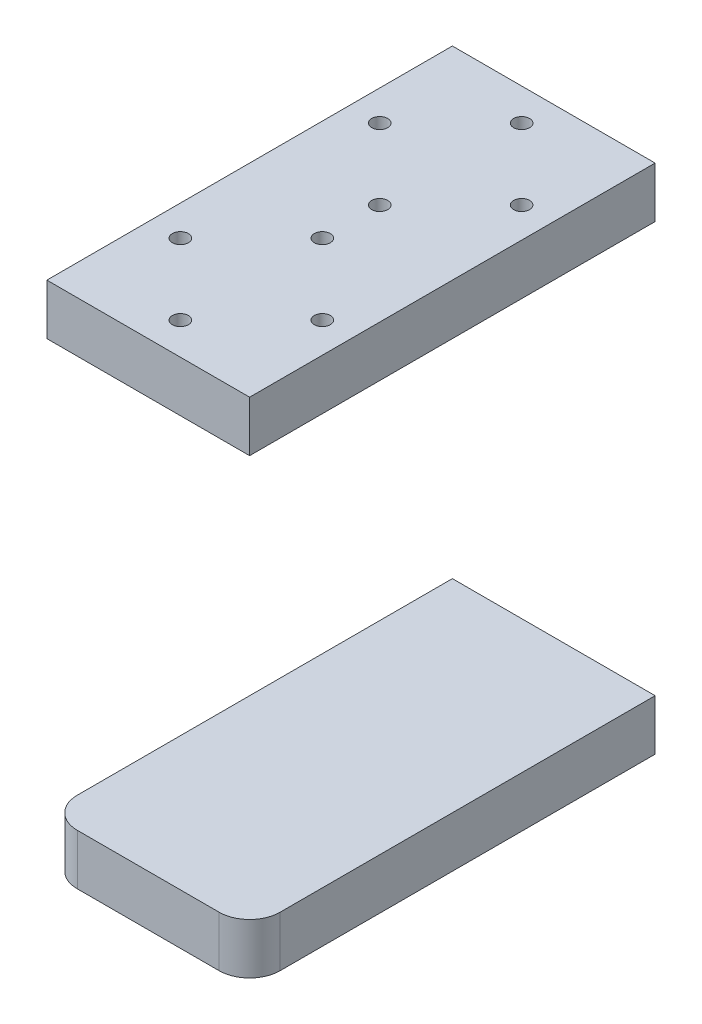
ISO-10303-21;
HEADER;
FILE_DESCRIPTION(('STEP AP214'),'2;1');
FILE_NAME('part.step','',(''),(''),'','','');
FILE_SCHEMA(('AUTOMOTIVE_DESIGN { 1 0 10303 214 1 1 1 1 }'));
ENDSEC;
DATA;
#1=APPLICATION_CONTEXT('core data for automotive mechanical design processes');
#2=APPLICATION_PROTOCOL_DEFINITION('international standard','automotive_design',2000,#1);
#3=PRODUCT_CONTEXT('',#1,'mechanical');
#4=PRODUCT('Part','Part','',(#3));
#5=PRODUCT_RELATED_PRODUCT_CATEGORY('part','',(#4));
#6=PRODUCT_DEFINITION_FORMATION('','',#4);
#7=PRODUCT_DEFINITION_CONTEXT('part definition',#1,'design');
#8=PRODUCT_DEFINITION('design','',#6,#7);
#9=PRODUCT_DEFINITION_SHAPE('','',#8);
#10=(LENGTH_UNIT() NAMED_UNIT(*) SI_UNIT(.MILLI.,.METRE.));
#11=(NAMED_UNIT(*) PLANE_ANGLE_UNIT() SI_UNIT($,.RADIAN.));
#12=(NAMED_UNIT(*) SI_UNIT($,.STERADIAN.) SOLID_ANGLE_UNIT());
#13=UNCERTAINTY_MEASURE_WITH_UNIT(LENGTH_MEASURE(1.E-05),#10,'distance_accuracy_value','');
#14=(GEOMETRIC_REPRESENTATION_CONTEXT(3) GLOBAL_UNCERTAINTY_ASSIGNED_CONTEXT((#13)) GLOBAL_UNIT_ASSIGNED_CONTEXT((#10,
#11,#12)) REPRESENTATION_CONTEXT('',''));
#15=CARTESIAN_POINT('',(0.,0.,0.));
#16=DIRECTION('',(0.,0.,1.));
#17=DIRECTION('',(1.,0.,0.));
#18=AXIS2_PLACEMENT_3D('',#15,#16,#17);
#19=CARTESIAN_POINT('',(0.,0.,40.));
#20=DIRECTION('',(1.,0.,0.));
#21=DIRECTION('',(0.,0.,-1.));
#22=AXIS2_PLACEMENT_3D('',#19,#20,#21);
#23=PLANE('',#22);
#24=DIRECTION('',(0.,-1.,0.));
#25=VECTOR('',#24,1.);
#26=CARTESIAN_POINT('',(0.,0.,0.));
#27=LINE('',#26,#25);
#28=CARTESIAN_POINT('',(0.,50.5,0.));
#29=VERTEX_POINT('',#28);
#30=CARTESIAN_POINT('',(0.,45.5,0.));
#31=VERTEX_POINT('',#30);
#32=EDGE_CURVE('E86',#29,#31,#27,.T.);
#33=ORIENTED_EDGE('',*,*,#32,.T.);
#34=DIRECTION('',(0.,0.,1.));
#35=VECTOR('',#34,1.);
#36=CARTESIAN_POINT('',(0.,45.5,0.));
#37=LINE('',#36,#35);
#38=CARTESIAN_POINT('',(0.,45.5,40.));
#39=VERTEX_POINT('',#38);
#40=EDGE_CURVE('E77',#31,#39,#37,.T.);
#41=ORIENTED_EDGE('',*,*,#40,.T.);
#42=DIRECTION('',(0.,-1.,0.));
#43=VECTOR('',#42,1.);
#44=CARTESIAN_POINT('',(0.,0.,40.));
#45=LINE('',#44,#43);
#46=CARTESIAN_POINT('',(0.,50.5,40.));
#47=VERTEX_POINT('',#46);
#48=EDGE_CURVE('E145',#47,#39,#45,.T.);
#49=ORIENTED_EDGE('',*,*,#48,.F.);
#50=DIRECTION('',(0.,0.,-1.));
#51=VECTOR('',#50,1.);
#52=CARTESIAN_POINT('',(0.,50.5,40.));
#53=LINE('',#52,#51);
#54=EDGE_CURVE('E85',#47,#29,#53,.T.);
#55=ORIENTED_EDGE('',*,*,#54,.T.);
#56=EDGE_LOOP('',(#33,#41,#49,#55));
#57=FACE_BOUND('',#56,.T.);
#58=ADVANCED_FACE('F43',(#57),#23,.F.);
#59=CARTESIAN_POINT('',(20.,0.,40.));
#60=DIRECTION('',(-1.,0.,0.));
#61=DIRECTION('',(0.,0.,1.));
#62=AXIS2_PLACEMENT_3D('',#59,#60,#61);
#63=PLANE('',#62);
#64=DIRECTION('',(0.,1.,0.));
#65=VECTOR('',#64,1.);
#66=CARTESIAN_POINT('',(20.,0.,40.));
#67=LINE('',#66,#65);
#68=CARTESIAN_POINT('',(20.,45.5,40.));
#69=VERTEX_POINT('',#68);
#70=CARTESIAN_POINT('',(20.,50.5,40.));
#71=VERTEX_POINT('',#70);
#72=EDGE_CURVE('E142',#69,#71,#67,.T.);
#73=ORIENTED_EDGE('',*,*,#72,.F.);
#74=DIRECTION('',(0.,0.,1.));
#75=VECTOR('',#74,1.);
#76=CARTESIAN_POINT('',(20.,45.5,0.));
#77=LINE('',#76,#75);
#78=CARTESIAN_POINT('',(20.,45.5,0.));
#79=VERTEX_POINT('',#78);
#80=EDGE_CURVE('E12',#79,#69,#77,.T.);
#81=ORIENTED_EDGE('',*,*,#80,.F.);
#82=DIRECTION('',(0.,1.,0.));
#83=VECTOR('',#82,1.);
#84=CARTESIAN_POINT('',(20.,0.,0.));
#85=LINE('',#84,#83);
#86=CARTESIAN_POINT('',(20.,50.5,0.));
#87=VERTEX_POINT('',#86);
#88=EDGE_CURVE('E93',#79,#87,#85,.T.);
#89=ORIENTED_EDGE('',*,*,#88,.T.);
#90=DIRECTION('',(0.,0.,-1.));
#91=VECTOR('',#90,1.);
#92=CARTESIAN_POINT('',(20.,50.5,40.));
#93=LINE('',#92,#91);
#94=EDGE_CURVE('E137',#71,#87,#93,.T.);
#95=ORIENTED_EDGE('',*,*,#94,.F.);
#96=EDGE_LOOP('',(#73,#81,#89,#95));
#97=FACE_BOUND('',#96,.T.);
#98=ADVANCED_FACE('F150',(#97),#63,.F.);
#99=CARTESIAN_POINT('',(0.,0.,40.));
#100=DIRECTION('',(0.,0.,-1.));
#101=DIRECTION('',(-1.,0.,0.));
#102=AXIS2_PLACEMENT_3D('',#99,#100,#101);
#103=PLANE('',#102);
#104=ORIENTED_EDGE('',*,*,#48,.T.);
#105=DIRECTION('',(-1.,0.,0.));
#106=VECTOR('',#105,1.);
#107=CARTESIAN_POINT('',(0.,45.5,40.));
#108=LINE('',#107,#106);
#109=EDGE_CURVE('E52',#69,#39,#108,.T.);
#110=ORIENTED_EDGE('',*,*,#109,.F.);
#111=ORIENTED_EDGE('',*,*,#72,.T.);
#112=DIRECTION('',(-1.,0.,0.));
#113=VECTOR('',#112,1.);
#114=CARTESIAN_POINT('',(0.,50.5,40.));
#115=LINE('',#114,#113);
#116=EDGE_CURVE('E95',#71,#47,#115,.T.);
#117=ORIENTED_EDGE('',*,*,#116,.T.);
#118=EDGE_LOOP('',(#104,#110,#111,#117));
#119=FACE_BOUND('',#118,.T.);
#120=ADVANCED_FACE('F154',(#119),#103,.F.);
#121=CARTESIAN_POINT('',(0.,0.,0.));
#122=DIRECTION('',(0.,0.,-1.));
#123=DIRECTION('',(-1.,0.,0.));
#124=AXIS2_PLACEMENT_3D('',#121,#122,#123);
#125=PLANE('',#124);
#126=DIRECTION('',(-1.,0.,0.));
#127=VECTOR('',#126,1.);
#128=CARTESIAN_POINT('',(0.,45.5,0.));
#129=LINE('',#128,#127);
#130=EDGE_CURVE('E80',#79,#31,#129,.T.);
#131=ORIENTED_EDGE('',*,*,#130,.T.);
#132=ORIENTED_EDGE('',*,*,#32,.F.);
#133=DIRECTION('',(-1.,0.,0.));
#134=VECTOR('',#133,1.);
#135=CARTESIAN_POINT('',(0.,50.5,0.));
#136=LINE('',#135,#134);
#137=EDGE_CURVE('E94',#87,#29,#136,.T.);
#138=ORIENTED_EDGE('',*,*,#137,.F.);
#139=ORIENTED_EDGE('',*,*,#88,.F.);
#140=EDGE_LOOP('',(#131,#132,#138,#139));
#141=FACE_BOUND('',#140,.T.);
#142=ADVANCED_FACE('F91',(#141),#125,.T.);
#143=CARTESIAN_POINT('',(0.,50.5,40.));
#144=DIRECTION('',(0.,-1.,0.));
#145=DIRECTION('',(0.,0.,-1.));
#146=AXIS2_PLACEMENT_3D('',#143,#144,#145);
#147=PLANE('',#146);
#148=CARTESIAN_POINT('',(9.99999999999996,50.5,22.8301418666942));
#149=DIRECTION('',(0.,1.,0.));
#150=DIRECTION('',(0.,0.,1.));
#151=AXIS2_PLACEMENT_3D('',#148,#149,#150);
#152=CIRCLE('',#151,0.790000000000002);
#153=CARTESIAN_POINT('',(9.99999999999996,50.5,23.6201418666942));
#154=VERTEX_POINT('',#153);
#155=EDGE_CURVE('E111',#154,#154,#152,.T.);
#156=ORIENTED_EDGE('',*,*,#155,.F.);
#157=EDGE_LOOP('',(#156));
#158=FACE_BOUND('',#157,.T.);
#159=CARTESIAN_POINT('',(2.99999999999997,50.5,29.8301418666942));
#160=DIRECTION('',(0.,1.,0.));
#161=DIRECTION('',(0.,0.,1.));
#162=AXIS2_PLACEMENT_3D('',#159,#160,#161);
#163=CIRCLE('',#162,0.789999999999999);
#164=CARTESIAN_POINT('',(2.99999999999997,50.5,30.6201418666942));
#165=VERTEX_POINT('',#164);
#166=EDGE_CURVE('E282',#165,#165,#163,.T.);
#167=ORIENTED_EDGE('',*,*,#166,.F.);
#168=EDGE_LOOP('',(#167));
#169=FACE_BOUND('',#168,.T.);
#170=CARTESIAN_POINT('',(9.99999999999997,50.5,36.8301418666942));
#171=DIRECTION('',(0.,1.,0.));
#172=DIRECTION('',(0.,0.,1.));
#173=AXIS2_PLACEMENT_3D('',#170,#171,#172);
#174=CIRCLE('',#173,0.789999999999997);
#175=CARTESIAN_POINT('',(9.99999999999997,50.5,37.6201418666942));
#176=VERTEX_POINT('',#175);
#177=EDGE_CURVE('E285',#176,#176,#174,.T.);
#178=ORIENTED_EDGE('',*,*,#177,.F.);
#179=EDGE_LOOP('',(#178));
#180=FACE_BOUND('',#179,.T.);
#181=CARTESIAN_POINT('',(17.,50.5,10.1698581333058));
#182=DIRECTION('',(0.,1.,0.));
#183=DIRECTION('',(0.,0.,-1.));
#184=AXIS2_PLACEMENT_3D('',#181,#182,#183);
#185=CIRCLE('',#184,0.789999999999999);
#186=CARTESIAN_POINT('',(17.,50.5,9.37985813330584));
#187=VERTEX_POINT('',#186);
#188=EDGE_CURVE('E294',#187,#187,#185,.T.);
#189=ORIENTED_EDGE('',*,*,#188,.F.);
#190=EDGE_LOOP('',(#189));
#191=FACE_BOUND('',#190,.T.);
#192=CARTESIAN_POINT('',(9.99999999999996,50.5,17.1698581333058));
#193=DIRECTION('',(0.,1.,0.));
#194=DIRECTION('',(0.,0.,-1.));
#195=AXIS2_PLACEMENT_3D('',#192,#193,#194);
#196=CIRCLE('',#195,0.790000000000002);
#197=CARTESIAN_POINT('',(9.99999999999996,50.5,16.3798581333058));
#198=VERTEX_POINT('',#197);
#199=EDGE_CURVE('E291',#198,#198,#196,.T.);
#200=ORIENTED_EDGE('',*,*,#199,.F.);
#201=EDGE_LOOP('',(#200));
#202=FACE_BOUND('',#201,.T.);
#203=CARTESIAN_POINT('',(2.99999999999997,50.5,10.1698581333058));
#204=DIRECTION('',(0.,1.,0.));
#205=DIRECTION('',(0.,0.,-1.));
#206=AXIS2_PLACEMENT_3D('',#203,#204,#205);
#207=CIRCLE('',#206,0.789999999999999);
#208=CARTESIAN_POINT('',(2.99999999999997,50.5,9.37985813330584));
#209=VERTEX_POINT('',#208);
#210=EDGE_CURVE('E135',#209,#209,#207,.T.);
#211=ORIENTED_EDGE('',*,*,#210,.F.);
#212=EDGE_LOOP('',(#211));
#213=FACE_BOUND('',#212,.T.);
#214=CARTESIAN_POINT('',(9.99999999999997,50.5,3.16985813330584));
#215=DIRECTION('',(0.,1.,0.));
#216=DIRECTION('',(0.,0.,-1.));
#217=AXIS2_PLACEMENT_3D('',#214,#215,#216);
#218=CIRCLE('',#217,0.789999999999997);
#219=CARTESIAN_POINT('',(9.99999999999997,50.5,2.37985813330585));
#220=VERTEX_POINT('',#219);
#221=EDGE_CURVE('E290',#220,#220,#218,.T.);
#222=ORIENTED_EDGE('',*,*,#221,.F.);
#223=EDGE_LOOP('',(#222));
#224=FACE_BOUND('',#223,.T.);
#225=CARTESIAN_POINT('',(17.,50.5,29.8301418666942));
#226=DIRECTION('',(0.,1.,0.));
#227=DIRECTION('',(0.,0.,1.));
#228=AXIS2_PLACEMENT_3D('',#225,#226,#227);
#229=CIRCLE('',#228,0.789999999999999);
#230=CARTESIAN_POINT('',(17.,50.5,30.6201418666942));
#231=VERTEX_POINT('',#230);
#232=EDGE_CURVE('E102',#231,#231,#229,.T.);
#233=ORIENTED_EDGE('',*,*,#232,.F.);
#234=EDGE_LOOP('',(#233));
#235=FACE_BOUND('',#234,.T.);
#236=ORIENTED_EDGE('',*,*,#137,.T.);
#237=ORIENTED_EDGE('',*,*,#54,.F.);
#238=ORIENTED_EDGE('',*,*,#116,.F.);
#239=ORIENTED_EDGE('',*,*,#94,.T.);
#240=EDGE_LOOP('',(#236,#237,#238,#239));
#241=FACE_BOUND('',#240,.T.);
#242=ADVANCED_FACE('F153',(#158,#169,#180,#191,#202,#213,#224,#235,#241),#147,.F.);
#243=CARTESIAN_POINT('',(0.,45.5,0.));
#244=DIRECTION('',(0.,1.,0.));
#245=DIRECTION('',(0.,0.,1.));
#246=AXIS2_PLACEMENT_3D('',#243,#244,#245);
#247=PLANE('',#246);
#248=CARTESIAN_POINT('',(9.99999999999996,45.5,22.8301418666942));
#249=DIRECTION('',(0.,1.,0.));
#250=DIRECTION('',(0.,0.,1.));
#251=AXIS2_PLACEMENT_3D('',#248,#249,#250);
#252=CIRCLE('',#251,0.790000000000002);
#253=CARTESIAN_POINT('',(9.99999999999996,45.5,23.6201418666942));
#254=VERTEX_POINT('',#253);
#255=EDGE_CURVE('E46',#254,#254,#252,.T.);
#256=ORIENTED_EDGE('',*,*,#255,.T.);
#257=EDGE_LOOP('',(#256));
#258=FACE_BOUND('',#257,.T.);
#259=CARTESIAN_POINT('',(2.99999999999997,45.5,29.8301418666942));
#260=DIRECTION('',(0.,1.,0.));
#261=DIRECTION('',(0.,0.,1.));
#262=AXIS2_PLACEMENT_3D('',#259,#260,#261);
#263=CIRCLE('',#262,0.789999999999999);
#264=CARTESIAN_POINT('',(2.99999999999997,45.5,30.6201418666942));
#265=VERTEX_POINT('',#264);
#266=EDGE_CURVE('E122',#265,#265,#263,.T.);
#267=ORIENTED_EDGE('',*,*,#266,.T.);
#268=EDGE_LOOP('',(#267));
#269=FACE_BOUND('',#268,.T.);
#270=CARTESIAN_POINT('',(9.99999999999997,45.5,36.8301418666942));
#271=DIRECTION('',(0.,1.,0.));
#272=DIRECTION('',(0.,0.,1.));
#273=AXIS2_PLACEMENT_3D('',#270,#271,#272);
#274=CIRCLE('',#273,0.789999999999997);
#275=CARTESIAN_POINT('',(9.99999999999997,45.5,37.6201418666942));
#276=VERTEX_POINT('',#275);
#277=EDGE_CURVE('E120',#276,#276,#274,.T.);
#278=ORIENTED_EDGE('',*,*,#277,.T.);
#279=EDGE_LOOP('',(#278));
#280=FACE_BOUND('',#279,.T.);
#281=CARTESIAN_POINT('',(17.,45.5,10.1698581333058));
#282=DIRECTION('',(0.,1.,0.));
#283=DIRECTION('',(0.,0.,1.));
#284=AXIS2_PLACEMENT_3D('',#281,#282,#283);
#285=CIRCLE('',#284,0.789999999999999);
#286=CARTESIAN_POINT('',(17.,45.5,10.9598581333058));
#287=VERTEX_POINT('',#286);
#288=EDGE_CURVE('E117',#287,#287,#285,.T.);
#289=ORIENTED_EDGE('',*,*,#288,.T.);
#290=EDGE_LOOP('',(#289));
#291=FACE_BOUND('',#290,.T.);
#292=CARTESIAN_POINT('',(9.99999999999996,45.5,17.1698581333058));
#293=DIRECTION('',(0.,1.,0.));
#294=DIRECTION('',(0.,0.,1.));
#295=AXIS2_PLACEMENT_3D('',#292,#293,#294);
#296=CIRCLE('',#295,0.790000000000002);
#297=CARTESIAN_POINT('',(9.99999999999996,45.5,17.9598581333058));
#298=VERTEX_POINT('',#297);
#299=EDGE_CURVE('E114',#298,#298,#296,.T.);
#300=ORIENTED_EDGE('',*,*,#299,.T.);
#301=EDGE_LOOP('',(#300));
#302=FACE_BOUND('',#301,.T.);
#303=CARTESIAN_POINT('',(2.99999999999997,45.5,10.1698581333058));
#304=DIRECTION('',(0.,1.,0.));
#305=DIRECTION('',(0.,0.,1.));
#306=AXIS2_PLACEMENT_3D('',#303,#304,#305);
#307=CIRCLE('',#306,0.789999999999999);
#308=CARTESIAN_POINT('',(2.99999999999997,45.5,10.9598581333058));
#309=VERTEX_POINT('',#308);
#310=EDGE_CURVE('E110',#309,#309,#307,.T.);
#311=ORIENTED_EDGE('',*,*,#310,.T.);
#312=EDGE_LOOP('',(#311));
#313=FACE_BOUND('',#312,.T.);
#314=CARTESIAN_POINT('',(9.99999999999997,45.5,3.16985813330584));
#315=DIRECTION('',(0.,1.,0.));
#316=DIRECTION('',(0.,0.,1.));
#317=AXIS2_PLACEMENT_3D('',#314,#315,#316);
#318=CIRCLE('',#317,0.789999999999997);
#319=CARTESIAN_POINT('',(9.99999999999997,45.5,3.95985813330584));
#320=VERTEX_POINT('',#319);
#321=EDGE_CURVE('E107',#320,#320,#318,.T.);
#322=ORIENTED_EDGE('',*,*,#321,.T.);
#323=EDGE_LOOP('',(#322));
#324=FACE_BOUND('',#323,.T.);
#325=CARTESIAN_POINT('',(17.,45.5,29.8301418666942));
#326=DIRECTION('',(0.,1.,0.));
#327=DIRECTION('',(0.,0.,1.));
#328=AXIS2_PLACEMENT_3D('',#325,#326,#327);
#329=CIRCLE('',#328,0.789999999999999);
#330=CARTESIAN_POINT('',(17.,45.5,30.6201418666942));
#331=VERTEX_POINT('',#330);
#332=EDGE_CURVE('E99',#331,#331,#329,.T.);
#333=ORIENTED_EDGE('',*,*,#332,.T.);
#334=EDGE_LOOP('',(#333));
#335=FACE_BOUND('',#334,.T.);
#336=ORIENTED_EDGE('',*,*,#109,.T.);
#337=ORIENTED_EDGE('',*,*,#40,.F.);
#338=ORIENTED_EDGE('',*,*,#130,.F.);
#339=ORIENTED_EDGE('',*,*,#80,.T.);
#340=EDGE_LOOP('',(#336,#337,#338,#339));
#341=FACE_BOUND('',#340,.T.);
#342=ADVANCED_FACE('F79',(#258,#269,#280,#291,#302,#313,#324,#335,#341),#247,.F.);
#343=CARTESIAN_POINT('',(17.,30.5,29.8301418666942));
#344=DIRECTION('',(0.,1.,0.));
#345=DIRECTION('',(0.,0.,1.));
#346=AXIS2_PLACEMENT_3D('',#343,#344,#345);
#347=CYLINDRICAL_SURFACE('',#346,0.789999999999999);
#348=ORIENTED_EDGE('',*,*,#232,.T.);
#349=EDGE_LOOP('',(#348));
#350=FACE_BOUND('',#349,.T.);
#351=ORIENTED_EDGE('',*,*,#332,.F.);
#352=EDGE_LOOP('',(#351));
#353=FACE_BOUND('',#352,.T.);
#354=ADVANCED_FACE('F198',(#350,#353),#347,.F.);
#355=CARTESIAN_POINT('',(9.99999999999997,30.5,3.16985813330584));
#356=DIRECTION('',(0.,1.,0.));
#357=DIRECTION('',(0.,0.,1.));
#358=AXIS2_PLACEMENT_3D('',#355,#356,#357);
#359=CYLINDRICAL_SURFACE('',#358,0.789999999999997);
#360=ORIENTED_EDGE('',*,*,#221,.T.);
#361=EDGE_LOOP('',(#360));
#362=FACE_BOUND('',#361,.T.);
#363=ORIENTED_EDGE('',*,*,#321,.F.);
#364=EDGE_LOOP('',(#363));
#365=FACE_BOUND('',#364,.T.);
#366=ADVANCED_FACE('F206',(#362,#365),#359,.F.);
#367=CARTESIAN_POINT('',(2.99999999999997,30.5,10.1698581333058));
#368=DIRECTION('',(0.,1.,0.));
#369=DIRECTION('',(0.,0.,1.));
#370=AXIS2_PLACEMENT_3D('',#367,#368,#369);
#371=CYLINDRICAL_SURFACE('',#370,0.789999999999999);
#372=ORIENTED_EDGE('',*,*,#210,.T.);
#373=EDGE_LOOP('',(#372));
#374=FACE_BOUND('',#373,.T.);
#375=ORIENTED_EDGE('',*,*,#310,.F.);
#376=EDGE_LOOP('',(#375));
#377=FACE_BOUND('',#376,.T.);
#378=ADVANCED_FACE('F215',(#374,#377),#371,.F.);
#379=CARTESIAN_POINT('',(9.99999999999996,30.5,17.1698581333058));
#380=DIRECTION('',(0.,1.,0.));
#381=DIRECTION('',(0.,0.,1.));
#382=AXIS2_PLACEMENT_3D('',#379,#380,#381);
#383=CYLINDRICAL_SURFACE('',#382,0.790000000000002);
#384=ORIENTED_EDGE('',*,*,#199,.T.);
#385=EDGE_LOOP('',(#384));
#386=FACE_BOUND('',#385,.T.);
#387=ORIENTED_EDGE('',*,*,#299,.F.);
#388=EDGE_LOOP('',(#387));
#389=FACE_BOUND('',#388,.T.);
#390=ADVANCED_FACE('F225',(#386,#389),#383,.F.);
#391=CARTESIAN_POINT('',(17.,30.5,10.1698581333058));
#392=DIRECTION('',(0.,1.,0.));
#393=DIRECTION('',(0.,0.,1.));
#394=AXIS2_PLACEMENT_3D('',#391,#392,#393);
#395=CYLINDRICAL_SURFACE('',#394,0.789999999999999);
#396=ORIENTED_EDGE('',*,*,#188,.T.);
#397=EDGE_LOOP('',(#396));
#398=FACE_BOUND('',#397,.T.);
#399=ORIENTED_EDGE('',*,*,#288,.F.);
#400=EDGE_LOOP('',(#399));
#401=FACE_BOUND('',#400,.T.);
#402=ADVANCED_FACE('F235',(#398,#401),#395,.F.);
#403=CARTESIAN_POINT('',(9.99999999999997,30.5,36.8301418666942));
#404=DIRECTION('',(0.,1.,0.));
#405=DIRECTION('',(0.,0.,1.));
#406=AXIS2_PLACEMENT_3D('',#403,#404,#405);
#407=CYLINDRICAL_SURFACE('',#406,0.789999999999997);
#408=ORIENTED_EDGE('',*,*,#177,.T.);
#409=EDGE_LOOP('',(#408));
#410=FACE_BOUND('',#409,.T.);
#411=ORIENTED_EDGE('',*,*,#277,.F.);
#412=EDGE_LOOP('',(#411));
#413=FACE_BOUND('',#412,.T.);
#414=ADVANCED_FACE('F245',(#410,#413),#407,.F.);
#415=CARTESIAN_POINT('',(2.99999999999997,30.5,29.8301418666942));
#416=DIRECTION('',(0.,1.,0.));
#417=DIRECTION('',(0.,0.,1.));
#418=AXIS2_PLACEMENT_3D('',#415,#416,#417);
#419=CYLINDRICAL_SURFACE('',#418,0.789999999999999);
#420=ORIENTED_EDGE('',*,*,#166,.T.);
#421=EDGE_LOOP('',(#420));
#422=FACE_BOUND('',#421,.T.);
#423=ORIENTED_EDGE('',*,*,#266,.F.);
#424=EDGE_LOOP('',(#423));
#425=FACE_BOUND('',#424,.T.);
#426=ADVANCED_FACE('F255',(#422,#425),#419,.F.);
#427=CARTESIAN_POINT('',(9.99999999999996,30.5,22.8301418666942));
#428=DIRECTION('',(0.,1.,0.));
#429=DIRECTION('',(0.,0.,1.));
#430=AXIS2_PLACEMENT_3D('',#427,#428,#429);
#431=CYLINDRICAL_SURFACE('',#430,0.790000000000002);
#432=ORIENTED_EDGE('',*,*,#155,.T.);
#433=EDGE_LOOP('',(#432));
#434=FACE_BOUND('',#433,.T.);
#435=ORIENTED_EDGE('',*,*,#255,.F.);
#436=EDGE_LOOP('',(#435));
#437=FACE_BOUND('',#436,.T.);
#438=ADVANCED_FACE('F265',(#434,#437),#431,.F.);
#439=CLOSED_SHELL('',(#58,#98,#120,#142,#242,#342,#354,#366,#378,#390,#402,#414,#426,#438));
#440=MANIFOLD_SOLID_BREP('B2',#439);
#441=CARTESIAN_POINT('',(0.,0.,40.));
#442=DIRECTION('',(0.,1.,0.));
#443=DIRECTION('',(0.,0.,1.));
#444=AXIS2_PLACEMENT_3D('',#441,#442,#443);
#445=PLANE('',#444);
#446=DIRECTION('',(1.,0.,0.));
#447=VECTOR('',#446,1.);
#448=CARTESIAN_POINT('',(0.,0.,40.));
#449=LINE('',#448,#447);
#450=CARTESIAN_POINT('',(3.,0.,40.));
#451=VERTEX_POINT('',#450);
#452=CARTESIAN_POINT('',(17.,0.,40.));
#453=VERTEX_POINT('',#452);
#454=EDGE_CURVE('E411',#451,#453,#449,.T.);
#455=ORIENTED_EDGE('',*,*,#454,.F.);
#456=CARTESIAN_POINT('',(3.,0.,37.));
#457=DIRECTION('',(0.,1.,0.));
#458=DIRECTION('',(0.,0.,1.));
#459=AXIS2_PLACEMENT_3D('',#456,#457,#458);
#460=CIRCLE('',#459,3.);
#461=CARTESIAN_POINT('',(0.,0.,37.));
#462=VERTEX_POINT('',#461);
#463=EDGE_CURVE('E426',#451,#462,#460,.F.);
#464=ORIENTED_EDGE('',*,*,#463,.T.);
#465=DIRECTION('',(0.,0.,-1.));
#466=VECTOR('',#465,1.);
#467=CARTESIAN_POINT('',(0.,0.,40.));
#468=LINE('',#467,#466);
#469=CARTESIAN_POINT('',(0.,0.,0.));
#470=VERTEX_POINT('',#469);
#471=EDGE_CURVE('E416',#462,#470,#468,.T.);
#472=ORIENTED_EDGE('',*,*,#471,.T.);
#473=DIRECTION('',(1.,0.,0.));
#474=VECTOR('',#473,1.);
#475=CARTESIAN_POINT('',(0.,0.,0.));
#476=LINE('',#475,#474);
#477=CARTESIAN_POINT('',(20.,0.,0.));
#478=VERTEX_POINT('',#477);
#479=EDGE_CURVE('E405',#470,#478,#476,.T.);
#480=ORIENTED_EDGE('',*,*,#479,.T.);
#481=DIRECTION('',(0.,0.,-1.));
#482=VECTOR('',#481,1.);
#483=CARTESIAN_POINT('',(20.,0.,40.));
#484=LINE('',#483,#482);
#485=CARTESIAN_POINT('',(20.,0.,37.));
#486=VERTEX_POINT('',#485);
#487=EDGE_CURVE('E414',#486,#478,#484,.T.);
#488=ORIENTED_EDGE('',*,*,#487,.F.);
#489=CARTESIAN_POINT('',(17.,0.,37.));
#490=DIRECTION('',(0.,1.,0.));
#491=DIRECTION('',(0.,0.,1.));
#492=AXIS2_PLACEMENT_3D('',#489,#490,#491);
#493=CIRCLE('',#492,3.);
#494=EDGE_CURVE('E424',#486,#453,#493,.F.);
#495=ORIENTED_EDGE('',*,*,#494,.T.);
#496=EDGE_LOOP('',(#455,#464,#472,#480,#488,#495));
#497=FACE_BOUND('',#496,.T.);
#498=ADVANCED_FACE('F335',(#497),#445,.F.);
#499=CARTESIAN_POINT('',(0.,0.,40.));
#500=DIRECTION('',(0.,0.,-1.));
#501=DIRECTION('',(-1.,0.,0.));
#502=AXIS2_PLACEMENT_3D('',#499,#500,#501);
#503=PLANE('',#502);
#504=DIRECTION('',(1.,0.,0.));
#505=VECTOR('',#504,1.);
#506=CARTESIAN_POINT('',(0.,5.,40.));
#507=LINE('',#506,#505);
#508=CARTESIAN_POINT('',(3.,5.,40.));
#509=VERTEX_POINT('',#508);
#510=CARTESIAN_POINT('',(17.,5.,40.));
#511=VERTEX_POINT('',#510);
#512=EDGE_CURVE('E396',#509,#511,#507,.T.);
#513=ORIENTED_EDGE('',*,*,#512,.F.);
#514=DIRECTION('',(0.,-1.,0.));
#515=VECTOR('',#514,1.);
#516=CARTESIAN_POINT('',(3.,0.,40.));
#517=LINE('',#516,#515);
#518=EDGE_CURVE('E421',#509,#451,#517,.T.);
#519=ORIENTED_EDGE('',*,*,#518,.T.);
#520=ORIENTED_EDGE('',*,*,#454,.T.);
#521=DIRECTION('',(0.,1.,0.));
#522=VECTOR('',#521,1.);
#523=CARTESIAN_POINT('',(17.,0.,40.));
#524=LINE('',#523,#522);
#525=EDGE_CURVE('E418',#453,#511,#524,.T.);
#526=ORIENTED_EDGE('',*,*,#525,.T.);
#527=EDGE_LOOP('',(#513,#519,#520,#526));
#528=FACE_BOUND('',#527,.T.);
#529=ADVANCED_FACE('F433',(#528),#503,.F.);
#530=CARTESIAN_POINT('',(0.,0.,0.));
#531=DIRECTION('',(0.,0.,-1.));
#532=DIRECTION('',(-1.,0.,0.));
#533=AXIS2_PLACEMENT_3D('',#530,#531,#532);
#534=PLANE('',#533);
#535=DIRECTION('',(1.,0.,0.));
#536=VECTOR('',#535,1.);
#537=CARTESIAN_POINT('',(0.,5.,0.));
#538=LINE('',#537,#536);
#539=CARTESIAN_POINT('',(0.,5.,0.));
#540=VERTEX_POINT('',#539);
#541=CARTESIAN_POINT('',(20.,5.,0.));
#542=VERTEX_POINT('',#541);
#543=EDGE_CURVE('E387',#540,#542,#538,.T.);
#544=ORIENTED_EDGE('',*,*,#543,.T.);
#545=DIRECTION('',(0.,1.,0.));
#546=VECTOR('',#545,1.);
#547=CARTESIAN_POINT('',(20.,0.,0.));
#548=LINE('',#547,#546);
#549=EDGE_CURVE('E407',#478,#542,#548,.T.);
#550=ORIENTED_EDGE('',*,*,#549,.F.);
#551=ORIENTED_EDGE('',*,*,#479,.F.);
#552=DIRECTION('',(0.,-1.,0.));
#553=VECTOR('',#552,1.);
#554=CARTESIAN_POINT('',(0.,0.,0.));
#555=LINE('',#554,#553);
#556=EDGE_CURVE('E400',#540,#470,#555,.T.);
#557=ORIENTED_EDGE('',*,*,#556,.F.);
#558=EDGE_LOOP('',(#544,#550,#551,#557));
#559=FACE_BOUND('',#558,.T.);
#560=ADVANCED_FACE('F403',(#559),#534,.T.);
#561=CARTESIAN_POINT('',(20.,0.,40.));
#562=DIRECTION('',(-1.,0.,0.));
#563=DIRECTION('',(0.,0.,1.));
#564=AXIS2_PLACEMENT_3D('',#561,#562,#563);
#565=PLANE('',#564);
#566=DIRECTION('',(0.,0.,1.));
#567=VECTOR('',#566,1.);
#568=CARTESIAN_POINT('',(20.,5.,0.));
#569=LINE('',#568,#567);
#570=CARTESIAN_POINT('',(20.,5.,37.));
#571=VERTEX_POINT('',#570);
#572=EDGE_CURVE('E391',#542,#571,#569,.T.);
#573=ORIENTED_EDGE('',*,*,#572,.T.);
#574=DIRECTION('',(0.,1.,0.));
#575=VECTOR('',#574,1.);
#576=CARTESIAN_POINT('',(20.,0.,37.));
#577=LINE('',#576,#575);
#578=EDGE_CURVE('E41',#571,#486,#577,.F.);
#579=ORIENTED_EDGE('',*,*,#578,.T.);
#580=ORIENTED_EDGE('',*,*,#487,.T.);
#581=ORIENTED_EDGE('',*,*,#549,.T.);
#582=EDGE_LOOP('',(#573,#579,#580,#581));
#583=FACE_BOUND('',#582,.T.);
#584=ADVANCED_FACE('F445',(#583),#565,.F.);
#585=CARTESIAN_POINT('',(0.,0.,40.));
#586=DIRECTION('',(1.,0.,0.));
#587=DIRECTION('',(0.,0.,-1.));
#588=AXIS2_PLACEMENT_3D('',#585,#586,#587);
#589=PLANE('',#588);
#590=ORIENTED_EDGE('',*,*,#471,.F.);
#591=DIRECTION('',(0.,-1.,0.));
#592=VECTOR('',#591,1.);
#593=CARTESIAN_POINT('',(0.,0.,37.));
#594=LINE('',#593,#592);
#595=CARTESIAN_POINT('',(0.,5.,37.));
#596=VERTEX_POINT('',#595);
#597=EDGE_CURVE('E358',#462,#596,#594,.F.);
#598=ORIENTED_EDGE('',*,*,#597,.T.);
#599=DIRECTION('',(0.,0.,1.));
#600=VECTOR('',#599,1.);
#601=CARTESIAN_POINT('',(0.,5.,0.));
#602=LINE('',#601,#600);
#603=EDGE_CURVE('E389',#540,#596,#602,.T.);
#604=ORIENTED_EDGE('',*,*,#603,.F.);
#605=ORIENTED_EDGE('',*,*,#556,.T.);
#606=EDGE_LOOP('',(#590,#598,#604,#605));
#607=FACE_BOUND('',#606,.T.);
#608=ADVANCED_FACE('F399',(#607),#589,.F.);
#609=CARTESIAN_POINT('',(0.,5.,0.));
#610=DIRECTION('',(0.,-1.,0.));
#611=DIRECTION('',(1.,0.,0.));
#612=AXIS2_PLACEMENT_3D('',#609,#610,#611);
#613=PLANE('',#612);
#614=ORIENTED_EDGE('',*,*,#603,.T.);
#615=CARTESIAN_POINT('',(3.,5.,37.));
#616=DIRECTION('',(0.,-1.,0.));
#617=DIRECTION('',(1.,0.,0.));
#618=AXIS2_PLACEMENT_3D('',#615,#616,#617);
#619=CIRCLE('',#618,3.);
#620=EDGE_CURVE('E343',#596,#509,#619,.F.);
#621=ORIENTED_EDGE('',*,*,#620,.T.);
#622=ORIENTED_EDGE('',*,*,#512,.T.);
#623=CARTESIAN_POINT('',(17.,5.,37.));
#624=DIRECTION('',(0.,-1.,0.));
#625=DIRECTION('',(1.,0.,0.));
#626=AXIS2_PLACEMENT_3D('',#623,#624,#625);
#627=CIRCLE('',#626,3.);
#628=EDGE_CURVE('E350',#511,#571,#627,.F.);
#629=ORIENTED_EDGE('',*,*,#628,.T.);
#630=ORIENTED_EDGE('',*,*,#572,.F.);
#631=ORIENTED_EDGE('',*,*,#543,.F.);
#632=EDGE_LOOP('',(#614,#621,#622,#629,#630,#631));
#633=FACE_BOUND('',#632,.T.);
#634=ADVANCED_FACE('F388',(#633),#613,.F.);
#635=CARTESIAN_POINT('',(3.,0.,37.));
#636=DIRECTION('',(0.,-1.,0.));
#637=DIRECTION('',(0.,0.,-1.));
#638=AXIS2_PLACEMENT_3D('',#635,#636,#637);
#639=CYLINDRICAL_SURFACE('',#638,3.);
#640=ORIENTED_EDGE('',*,*,#620,.F.);
#641=ORIENTED_EDGE('',*,*,#597,.F.);
#642=ORIENTED_EDGE('',*,*,#463,.F.);
#643=ORIENTED_EDGE('',*,*,#518,.F.);
#644=EDGE_LOOP('',(#640,#641,#642,#643));
#645=FACE_BOUND('',#644,.T.);
#646=ADVANCED_FACE('F438',(#645),#639,.T.);
#647=CARTESIAN_POINT('',(17.,0.,37.));
#648=DIRECTION('',(0.,1.,0.));
#649=DIRECTION('',(0.,0.,1.));
#650=AXIS2_PLACEMENT_3D('',#647,#648,#649);
#651=CYLINDRICAL_SURFACE('',#650,3.);
#652=ORIENTED_EDGE('',*,*,#494,.F.);
#653=ORIENTED_EDGE('',*,*,#578,.F.);
#654=ORIENTED_EDGE('',*,*,#628,.F.);
#655=ORIENTED_EDGE('',*,*,#525,.F.);
#656=EDGE_LOOP('',(#652,#653,#654,#655));
#657=FACE_BOUND('',#656,.T.);
#658=ADVANCED_FACE('F337',(#657),#651,.T.);
#659=CLOSED_SHELL('',(#498,#529,#560,#584,#608,#634,#646,#658));
#660=MANIFOLD_SOLID_BREP('B6',#659);
#661=ADVANCED_BREP_SHAPE_REPRESENTATION('',(#18,#440,#660),#14);
#662=SHAPE_DEFINITION_REPRESENTATION(#9,#661);
ENDSEC;
END-ISO-10303-21;
